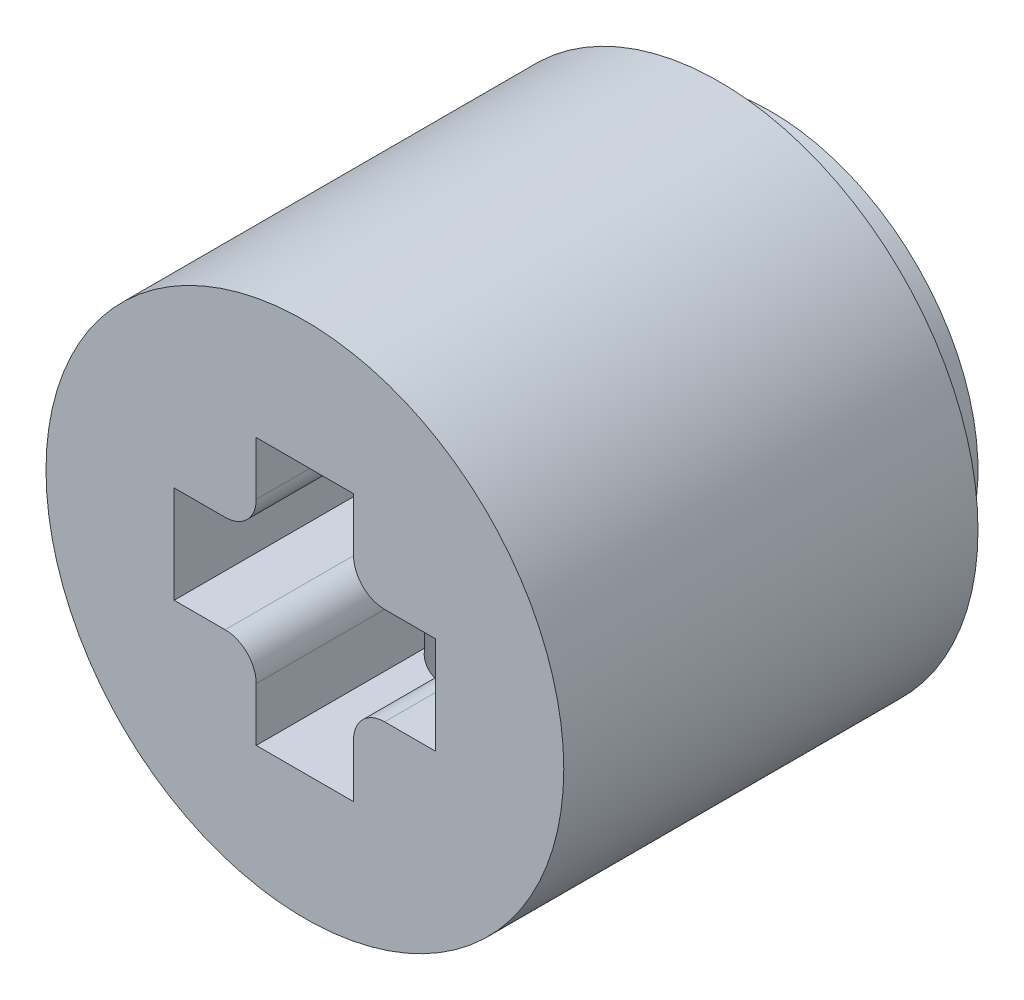
ISO-10303-21;
HEADER;
FILE_DESCRIPTION(('STEP AP214'),'2;1');
FILE_NAME('part.step','',(''),(''),'','','');
FILE_SCHEMA(('AUTOMOTIVE_DESIGN { 1 0 10303 214 1 1 1 1 }'));
ENDSEC;
DATA;
#1=APPLICATION_CONTEXT('core data for automotive mechanical design processes');
#2=APPLICATION_PROTOCOL_DEFINITION('international standard','automotive_design',2000,#1);
#3=PRODUCT_CONTEXT('',#1,'mechanical');
#4=PRODUCT('Part','Part','',(#3));
#5=PRODUCT_RELATED_PRODUCT_CATEGORY('part','',(#4));
#6=PRODUCT_DEFINITION_FORMATION('','',#4);
#7=PRODUCT_DEFINITION_CONTEXT('part definition',#1,'design');
#8=PRODUCT_DEFINITION('design','',#6,#7);
#9=PRODUCT_DEFINITION_SHAPE('','',#8);
#10=(LENGTH_UNIT() NAMED_UNIT(*) SI_UNIT(.MILLI.,.METRE.));
#11=(NAMED_UNIT(*) PLANE_ANGLE_UNIT() SI_UNIT($,.RADIAN.));
#12=(NAMED_UNIT(*) SI_UNIT($,.STERADIAN.) SOLID_ANGLE_UNIT());
#13=UNCERTAINTY_MEASURE_WITH_UNIT(LENGTH_MEASURE(1.E-05),#10,'distance_accuracy_value','');
#14=(GEOMETRIC_REPRESENTATION_CONTEXT(3) GLOBAL_UNCERTAINTY_ASSIGNED_CONTEXT((#13)) GLOBAL_UNIT_ASSIGNED_CONTEXT((#10,
#11,#12)) REPRESENTATION_CONTEXT('',''));
#15=CARTESIAN_POINT('',(0.,0.,0.));
#16=DIRECTION('',(0.,0.,1.));
#17=DIRECTION('',(1.,0.,0.));
#18=AXIS2_PLACEMENT_3D('',#15,#16,#17);
#19=CARTESIAN_POINT('',(0.,0.,8.));
#20=DIRECTION('',(0.,0.,-1.));
#21=DIRECTION('',(-1.,0.,0.));
#22=AXIS2_PLACEMENT_3D('',#19,#20,#21);
#23=CYLINDRICAL_SURFACE('',#22,5.);
#24=CARTESIAN_POINT('',(0.,0.,8.));
#25=DIRECTION('',(0.,0.,1.));
#26=DIRECTION('',(1.,0.,0.));
#27=AXIS2_PLACEMENT_3D('',#24,#25,#26);
#28=CIRCLE('',#27,5.);
#29=CARTESIAN_POINT('',(5.,0.,8.));
#30=VERTEX_POINT('',#29);
#31=EDGE_CURVE('E318',#30,#30,#28,.T.);
#32=ORIENTED_EDGE('',*,*,#31,.F.);
#33=EDGE_LOOP('',(#32));
#34=FACE_BOUND('',#33,.T.);
#35=CARTESIAN_POINT('',(0.,0.,0.));
#36=DIRECTION('',(0.,0.,1.));
#37=DIRECTION('',(1.,0.,0.));
#38=AXIS2_PLACEMENT_3D('',#35,#36,#37);
#39=CIRCLE('',#38,5.);
#40=CARTESIAN_POINT('',(5.,0.,0.));
#41=VERTEX_POINT('',#40);
#42=EDGE_CURVE('E322',#41,#41,#39,.T.);
#43=ORIENTED_EDGE('',*,*,#42,.T.);
#44=EDGE_LOOP('',(#43));
#45=FACE_BOUND('',#44,.T.);
#46=CARTESIAN_POINT('',(0.,-5.,2.8));
#47=CARTESIAN_POINT('',(0.0663855716114864,-4.99999882859871,2.80000200963091));
#48=CARTESIAN_POINT('',(0.132794168371227,-4.99866462539437,2.80552736409443));
#49=CARTESIAN_POINT('',(0.263713716388552,-4.99347135787729,2.82745309583815));
#50=CARTESIAN_POINT('',(0.328223473285709,-4.98961073848657,2.84386017119787));
#51=CARTESIAN_POINT('',(0.453435357885607,-4.97979292832786,2.88699693380174));
#52=CARTESIAN_POINT('',(0.51414176929929,-4.97383814811385,2.91371475594304));
#53=CARTESIAN_POINT('',(0.630210071519051,-4.96046901770033,2.97667417457835));
#54=CARTESIAN_POINT('',(0.685571885900661,-4.95305464663416,3.01291590723089));
#55=CARTESIAN_POINT('',(0.790437053575891,-4.93741544059215,3.09462567135023));
#56=CARTESIAN_POINT('',(0.839823808401929,-4.92917889817529,3.14024111241978));
#57=CARTESIAN_POINT('',(0.930324323247761,-4.91290297480301,3.23908754762578));
#58=CARTESIAN_POINT('',(0.971437218497919,-4.90486361453375,3.29231933681609));
#59=CARTESIAN_POINT('',(1.0447599742201,-4.88977518763566,3.40577833320728));
#60=CARTESIAN_POINT('',(1.0768415081904,-4.88274103265332,3.46609063350466));
#61=CARTESIAN_POINT('',(1.13036633178919,-4.87062933645708,3.59144793405027));
#62=CARTESIAN_POINT('',(1.15181117667772,-4.86555150921993,3.65649224080508));
#63=CARTESIAN_POINT('',(1.18306023243432,-4.85804738715009,3.78819062930807));
#64=CARTESIAN_POINT('',(1.19307304960329,-4.85557364192749,3.85479244861805));
#65=CARTESIAN_POINT('',(1.20182323551728,-4.85341558478987,3.98877295186686));
#66=CARTESIAN_POINT('',(1.20056228672949,-4.85373085664919,4.05615151838711));
#67=CARTESIAN_POINT('',(1.18696764832749,-4.85707245533718,4.1881903864046));
#68=CARTESIAN_POINT('',(1.1748804136019,-4.86003843681333,4.25287782607567));
#69=CARTESIAN_POINT('',(1.14036856654883,-4.86825134958978,4.37927892665928));
#70=CARTESIAN_POINT('',(1.11794326948813,-4.87349843197564,4.44099239029381));
#71=CARTESIAN_POINT('',(1.06317648492711,-4.88573906936737,4.5603651912337));
#72=CARTESIAN_POINT('',(1.03074379298784,-4.89274857302752,4.61798098116666));
#73=CARTESIAN_POINT('',(0.956946755825538,-4.90771500185066,4.72704180028904));
#74=CARTESIAN_POINT('',(0.915580961370592,-4.91567208064625,4.77848582611405));
#75=CARTESIAN_POINT('',(0.823805975635386,-4.93189281029482,4.87515742812749));
#76=CARTESIAN_POINT('',(0.773188257559633,-4.94015903152034,4.92018683962488));
#77=CARTESIAN_POINT('',(0.665022369838767,-4.95587806379738,5.00115388789855));
#78=CARTESIAN_POINT('',(0.607474019928563,-4.963330853682,5.03709128811705));
#79=CARTESIAN_POINT('',(0.486811390874324,-4.97661579827681,5.09891888824511));
#80=CARTESIAN_POINT('',(0.423681114784218,-4.98244308232075,5.12477898249512));
#81=CARTESIAN_POINT('',(0.293799042431471,-4.99178481896618,5.16546603161943));
#82=CARTESIAN_POINT('',(0.227047885355066,-4.99529967834603,5.18029492705073));
#83=CARTESIAN_POINT('',(0.0935149598606671,-4.99956110170834,5.19820082586081));
#84=CARTESIAN_POINT('',(0.0267713922180042,-5.00037128523014,5.20154795698463));
#85=CARTESIAN_POINT('',(-0.10632175263465,-4.99931229677893,5.19713329325964));
#86=CARTESIAN_POINT('',(-0.172671361905979,-4.99744334592699,5.18937241520511));
#87=CARTESIAN_POINT('',(-0.302169032043538,-4.99127665580872,5.16318520859344));
#88=CARTESIAN_POINT('',(-0.365348231724522,-4.98701206361468,5.14490435617047));
#89=CARTESIAN_POINT('',(-0.4877413200539,-4.9765334006264,5.0983607233219));
#90=CARTESIAN_POINT('',(-0.546954826656588,-4.97031914233272,5.07009698280879));
#91=CARTESIAN_POINT('',(-0.66082460398229,-4.9564764059839,5.00385336256082));
#92=CARTESIAN_POINT('',(-0.715388706961462,-4.94882612712371,4.96571971323012));
#93=CARTESIAN_POINT('',(-0.817439616386485,-4.93299745627709,4.88101722839477));
#94=CARTESIAN_POINT('',(-0.864925300297186,-4.92481898082043,4.83444705756819));
#95=CARTESIAN_POINT('',(-0.952569815159925,-4.90862968571996,4.73294366751606));
#96=CARTESIAN_POINT('',(-0.992539896190089,-4.90062677054122,4.67784595116521));
#97=CARTESIAN_POINT('',(-1.06266408329571,-4.88590155186362,4.56156382884325));
#98=CARTESIAN_POINT('',(-1.09281862889111,-4.8791791910297,4.50037969556988));
#99=CARTESIAN_POINT('',(-1.14223597407393,-4.86784758090162,4.37399499457781));
#100=CARTESIAN_POINT('',(-1.16156301755047,-4.86322589900105,4.30882071861005));
#101=CARTESIAN_POINT('',(-1.18895352114302,-4.85660290702284,4.17602152596881));
#102=CARTESIAN_POINT('',(-1.19701921710175,-4.85460107680137,4.10839709848778));
#103=CARTESIAN_POINT('',(-1.20154826579577,-4.85348184870242,3.97453171989209));
#104=CARTESIAN_POINT('',(-1.19831242636862,-4.85428966532108,3.90830140147048));
#105=CARTESIAN_POINT('',(-1.18101338250551,-4.85852705844985,3.77736009430937));
#106=CARTESIAN_POINT('',(-1.1669503636005,-4.8619565900351,3.71264907955515));
#107=CARTESIAN_POINT('',(-1.12855436521403,-4.87101099906117,3.58688097898101));
#108=CARTESIAN_POINT('',(-1.10427360818242,-4.87662470243525,3.52580709096658));
#109=CARTESIAN_POINT('',(-1.04617349432236,-4.88941734450978,3.40855823444644));
#110=CARTESIAN_POINT('',(-1.01235291973943,-4.89659648301093,3.35238389256544));
#111=CARTESIAN_POINT('',(-0.935172030833846,-4.91192773021097,3.24506519995222));
#112=CARTESIAN_POINT('',(-0.891601071916071,-4.92009914790113,3.19407507076052));
#113=CARTESIAN_POINT('',(-0.796572299092949,-4.93637439324597,3.10003200477923));
#114=CARTESIAN_POINT('',(-0.745112635496937,-4.94447820457766,3.0569809347159));
#115=CARTESIAN_POINT('',(-0.634753199520559,-4.9598628119832,2.9793562961781));
#116=CARTESIAN_POINT('',(-0.575745657437607,-4.96712800804875,2.9449326378232));
#117=CARTESIAN_POINT('',(-0.452614491314269,-4.97985522442328,2.88654818690084));
#118=CARTESIAN_POINT('',(-0.388494789476489,-4.98531861091419,2.86257946264335));
#119=CARTESIAN_POINT('',(-0.270354810277907,-4.99296239605987,2.82958454994488));
#120=CARTESIAN_POINT('',(-0.216924826507369,-4.99558397798318,2.81851335368572));
#121=CARTESIAN_POINT('',(-0.1090016909913,-4.99910320598099,2.80372048765925));
#122=CARTESIAN_POINT('',(-0.0545086071663108,-5.00000096182726,2.79999834990979));
#123=CARTESIAN_POINT('',(0.,-5.,2.8));
#124=B_SPLINE_CURVE_WITH_KNOTS('',3,(#46,#47,#48,#49,#50,#51,#52,#53,#54,#55,#56,#57,#58,#59,
#60,#61,#62,#63,#64,#65,#66,#67,#68,#69,#70,#71,#72,#73,#74,#75,#76,#77,#78,#79,#80,#81,#82,#83,
#84,#85,#86,#87,#88,#89,#90,#91,#92,#93,#94,#95,#96,#97,#98,#99,#100,#101,#102,#103,#104,#105,
#106,#107,#108,#109,#110,#111,#112,#113,#114,#115,#116,#117,#118,#119,#120,#121,#122,#123),
.UNSPECIFIED.,.T.,.F.,(4,2,2,2,2,2,2,2,2,2,2,2,2,2,2,2,2,2,2,2,2,2,2,2,2,2,2,2,2,2,2,2,2,2,2,2,
2,2,4),(0.,0.198957039746671,0.398036658303529,0.596887865634004,0.795741915994077,
0.998002280593426,1.20028377413322,1.40530904820339,1.61030433534015,1.81149598142534,
2.01265760269938,2.20935309983687,2.40606162681407,2.60461867006221,2.80320794977753,
3.00699983350526,3.2107970189862,3.41519845869033,3.61956393253918,3.81908710722082,
4.01859381530139,4.21540574945676,4.41223661682595,4.61234093252929,4.81247694820674,
5.0171129809052,5.22173984915262,5.42513936473276,5.62849849136058,5.82648661814791,
6.02447135235182,6.2214562540112,6.418466312115,6.62023378437708,6.82204863829062,
7.02715896821391,7.23211341832259,7.39548569211949,7.55884756216546),.UNSPECIFIED.);
#125=CARTESIAN_POINT('',(0.,-5.,2.8));
#126=VERTEX_POINT('',#125);
#127=EDGE_CURVE('E236',#126,#126,#124,.T.);
#128=ORIENTED_EDGE('',*,*,#127,.F.);
#129=EDGE_LOOP('',(#128));
#130=FACE_BOUND('',#129,.T.);
#131=ADVANCED_FACE('F69',(#34,#45,#130),#23,.T.);
#132=CARTESIAN_POINT('',(0.939999999999999,2.575,-1.));
#133=DIRECTION('',(-1.,0.,0.));
#134=DIRECTION('',(0.,-1.,0.));
#135=AXIS2_PLACEMENT_3D('',#132,#133,#134);
#136=PLANE('',#135);
#137=DIRECTION('',(0.,0.,1.));
#138=VECTOR('',#137,1.);
#139=CARTESIAN_POINT('',(0.94,-2.575,-1.));
#140=LINE('',#139,#138);
#141=CARTESIAN_POINT('',(0.94,-2.575,-1.));
#142=VERTEX_POINT('',#141);
#143=CARTESIAN_POINT('',(0.94,-2.575,3.25407775204114));
#144=VERTEX_POINT('',#143);
#145=EDGE_CURVE('E414',#142,#144,#140,.T.);
#146=ORIENTED_EDGE('',*,*,#145,.T.);
#147=DIRECTION('',(0.,-1.,0.));
#148=VECTOR('',#147,1.);
#149=CARTESIAN_POINT('',(0.94,-2.075,3.25407775204114));
#150=LINE('',#149,#148);
#151=CARTESIAN_POINT('',(0.94,-2.075,3.25407775204114));
#152=VERTEX_POINT('',#151);
#153=EDGE_CURVE('E228',#144,#152,#150,.F.);
#154=ORIENTED_EDGE('',*,*,#153,.T.);
#155=DIRECTION('',(0.,0.,-1.));
#156=VECTOR('',#155,1.);
#157=CARTESIAN_POINT('',(0.94,-2.075,-1.));
#158=LINE('',#157,#156);
#159=CARTESIAN_POINT('',(0.94,-2.075,4.74592224795886));
#160=VERTEX_POINT('',#159);
#161=EDGE_CURVE('E223',#160,#152,#158,.T.);
#162=ORIENTED_EDGE('',*,*,#161,.F.);
#163=DIRECTION('',(0.,-1.,0.));
#164=VECTOR('',#163,1.);
#165=CARTESIAN_POINT('',(0.94,-2.075,4.74592224795886));
#166=LINE('',#165,#164);
#167=CARTESIAN_POINT('',(0.94,-2.575,4.74592224795886));
#168=VERTEX_POINT('',#167);
#169=EDGE_CURVE('E207',#160,#168,#166,.T.);
#170=ORIENTED_EDGE('',*,*,#169,.T.);
#171=CARTESIAN_POINT('',(0.94,-2.575,8.));
#172=VERTEX_POINT('',#171);
#173=EDGE_CURVE('E397',#168,#172,#140,.T.);
#174=ORIENTED_EDGE('',*,*,#173,.T.);
#175=DIRECTION('',(0.,-1.,0.));
#176=VECTOR('',#175,1.);
#177=CARTESIAN_POINT('',(0.939999999999999,2.575,8.));
#178=LINE('',#177,#176);
#179=CARTESIAN_POINT('',(0.94,-1.54,8.));
#180=VERTEX_POINT('',#179);
#181=EDGE_CURVE('E481',#180,#172,#178,.T.);
#182=ORIENTED_EDGE('',*,*,#181,.F.);
#183=DIRECTION('',(0.,0.,-1.));
#184=VECTOR('',#183,1.);
#185=CARTESIAN_POINT('',(0.94,-1.54,-1.));
#186=LINE('',#185,#184);
#187=CARTESIAN_POINT('',(0.94,-1.54,-1.));
#188=VERTEX_POINT('',#187);
#189=EDGE_CURVE('E374',#180,#188,#186,.T.);
#190=ORIENTED_EDGE('',*,*,#189,.T.);
#191=DIRECTION('',(0.,-1.,0.));
#192=VECTOR('',#191,1.);
#193=CARTESIAN_POINT('',(0.939999999999999,2.575,-1.));
#194=LINE('',#193,#192);
#195=EDGE_CURVE('E466',#188,#142,#194,.T.);
#196=ORIENTED_EDGE('',*,*,#195,.T.);
#197=EDGE_LOOP('',(#146,#154,#162,#170,#174,#182,#190,#196));
#198=FACE_BOUND('',#197,.T.);
#199=ADVANCED_FACE('F227',(#198),#136,.T.);
#200=CARTESIAN_POINT('',(-0.94,-2.575,-1.));
#201=DIRECTION('',(0.,-1.,0.));
#202=DIRECTION('',(0.,0.,-1.));
#203=AXIS2_PLACEMENT_3D('',#200,#201,#202);
#204=PLANE('',#203);
#205=CARTESIAN_POINT('',(0.,-2.575,4.));
#206=DIRECTION('',(0.,-1.,0.));
#207=DIRECTION('',(0.,0.,-1.));
#208=AXIS2_PLACEMENT_3D('',#205,#206,#207);
#209=CIRCLE('',#208,1.2);
#210=CARTESIAN_POINT('',(-0.94,-2.575,4.74592224795886));
#211=VERTEX_POINT('',#210);
#212=EDGE_CURVE('E214',#211,#168,#209,.F.);
#213=ORIENTED_EDGE('',*,*,#212,.F.);
#214=DIRECTION('',(0.,0.,1.));
#215=VECTOR('',#214,1.);
#216=CARTESIAN_POINT('',(-0.94,-2.575,-1.));
#217=LINE('',#216,#215);
#218=CARTESIAN_POINT('',(-0.94,-2.575,8.));
#219=VERTEX_POINT('',#218);
#220=EDGE_CURVE('E395',#211,#219,#217,.T.);
#221=ORIENTED_EDGE('',*,*,#220,.T.);
#222=DIRECTION('',(1.,0.,0.));
#223=VECTOR('',#222,1.);
#224=CARTESIAN_POINT('',(-0.94,-2.575,8.));
#225=LINE('',#224,#223);
#226=EDGE_CURVE('E485',#219,#172,#225,.T.);
#227=ORIENTED_EDGE('',*,*,#226,.T.);
#228=ORIENTED_EDGE('',*,*,#173,.F.);
#229=EDGE_LOOP('',(#213,#221,#227,#228));
#230=FACE_BOUND('',#229,.T.);
#231=ADVANCED_FACE('F279',(#230),#204,.F.);
#232=CARTESIAN_POINT('',(-0.940000000000001,2.575,-1.));
#233=DIRECTION('',(-1.,0.,0.));
#234=DIRECTION('',(0.,-1.,0.));
#235=AXIS2_PLACEMENT_3D('',#232,#233,#234);
#236=PLANE('',#235);
#237=DIRECTION('',(0.,-1.,0.));
#238=VECTOR('',#237,1.);
#239=CARTESIAN_POINT('',(-0.94,-2.075,3.25407775204114));
#240=LINE('',#239,#238);
#241=CARTESIAN_POINT('',(-0.94,-2.575,3.25407775204114));
#242=VERTEX_POINT('',#241);
#243=CARTESIAN_POINT('',(-0.94,-2.075,3.25407775204114));
#244=VERTEX_POINT('',#243);
#245=EDGE_CURVE('E12',#242,#244,#240,.F.);
#246=ORIENTED_EDGE('',*,*,#245,.F.);
#247=CARTESIAN_POINT('',(-0.94,-2.575,-1.));
#248=VERTEX_POINT('',#247);
#249=EDGE_CURVE('E403',#248,#242,#217,.T.);
#250=ORIENTED_EDGE('',*,*,#249,.F.);
#251=DIRECTION('',(0.,-1.,0.));
#252=VECTOR('',#251,1.);
#253=CARTESIAN_POINT('',(-0.940000000000001,2.575,-1.));
#254=LINE('',#253,#252);
#255=CARTESIAN_POINT('',(-0.94,-1.54,-1.));
#256=VERTEX_POINT('',#255);
#257=EDGE_CURVE('E475',#256,#248,#254,.T.);
#258=ORIENTED_EDGE('',*,*,#257,.F.);
#259=DIRECTION('',(0.,0.,-1.));
#260=VECTOR('',#259,1.);
#261=CARTESIAN_POINT('',(-0.94,-1.54,-1.));
#262=LINE('',#261,#260);
#263=CARTESIAN_POINT('',(-0.94,-1.54,8.));
#264=VERTEX_POINT('',#263);
#265=EDGE_CURVE('E371',#256,#264,#262,.F.);
#266=ORIENTED_EDGE('',*,*,#265,.T.);
#267=DIRECTION('',(0.,-1.,0.));
#268=VECTOR('',#267,1.);
#269=CARTESIAN_POINT('',(-0.940000000000001,2.575,8.));
#270=LINE('',#269,#268);
#271=EDGE_CURVE('E400',#264,#219,#270,.T.);
#272=ORIENTED_EDGE('',*,*,#271,.T.);
#273=ORIENTED_EDGE('',*,*,#220,.F.);
#274=DIRECTION('',(0.,-1.,0.));
#275=VECTOR('',#274,1.);
#276=CARTESIAN_POINT('',(-0.94,-2.075,4.74592224795886));
#277=LINE('',#276,#275);
#278=CARTESIAN_POINT('',(-0.94,-2.075,4.74592224795886));
#279=VERTEX_POINT('',#278);
#280=EDGE_CURVE('E78',#279,#211,#277,.T.);
#281=ORIENTED_EDGE('',*,*,#280,.F.);
#282=DIRECTION('',(0.,0.,-1.));
#283=VECTOR('',#282,1.);
#284=CARTESIAN_POINT('',(-0.94,-2.075,-1.));
#285=LINE('',#284,#283);
#286=EDGE_CURVE('E387',#279,#244,#285,.T.);
#287=ORIENTED_EDGE('',*,*,#286,.T.);
#288=EDGE_LOOP('',(#246,#250,#258,#266,#272,#273,#281,#287));
#289=FACE_BOUND('',#288,.T.);
#290=ADVANCED_FACE('F275',(#289),#236,.F.);
#291=CARTESIAN_POINT('',(0.,0.,8.));
#292=DIRECTION('',(0.,0.,1.));
#293=DIRECTION('',(1.,0.,0.));
#294=AXIS2_PLACEMENT_3D('',#291,#292,#293);
#295=PLANE('',#294);
#296=ORIENTED_EDGE('',*,*,#31,.T.);
#297=EDGE_LOOP('',(#296));
#298=FACE_BOUND('',#297,.T.);
#299=DIRECTION('',(1.,0.,0.));
#300=VECTOR('',#299,1.);
#301=CARTESIAN_POINT('',(-2.525,0.94,8.));
#302=LINE('',#301,#300);
#303=CARTESIAN_POINT('',(-2.525,0.94,8.));
#304=VERTEX_POINT('',#303);
#305=CARTESIAN_POINT('',(-1.54,0.94,8.));
#306=VERTEX_POINT('',#305);
#307=EDGE_CURVE('E446',#304,#306,#302,.T.);
#308=ORIENTED_EDGE('',*,*,#307,.T.);
#309=CARTESIAN_POINT('',(-1.54,1.54,8.));
#310=DIRECTION('',(0.,0.,1.));
#311=DIRECTION('',(1.,0.,0.));
#312=AXIS2_PLACEMENT_3D('',#309,#310,#311);
#313=CIRCLE('',#312,0.6);
#314=CARTESIAN_POINT('',(-0.94,1.54,8.));
#315=VERTEX_POINT('',#314);
#316=EDGE_CURVE('E364',#306,#315,#313,.T.);
#317=ORIENTED_EDGE('',*,*,#316,.T.);
#318=CARTESIAN_POINT('',(-0.940000000000001,2.575,8.));
#319=VERTEX_POINT('',#318);
#320=EDGE_CURVE('E467',#319,#315,#270,.T.);
#321=ORIENTED_EDGE('',*,*,#320,.F.);
#322=DIRECTION('',(1.,0.,0.));
#323=VECTOR('',#322,1.);
#324=CARTESIAN_POINT('',(-0.940000000000001,2.575,8.));
#325=LINE('',#324,#323);
#326=CARTESIAN_POINT('',(0.939999999999999,2.575,8.));
#327=VERTEX_POINT('',#326);
#328=EDGE_CURVE('E245',#319,#327,#325,.T.);
#329=ORIENTED_EDGE('',*,*,#328,.T.);
#330=CARTESIAN_POINT('',(0.94,1.54,8.));
#331=VERTEX_POINT('',#330);
#332=EDGE_CURVE('E482',#327,#331,#178,.T.);
#333=ORIENTED_EDGE('',*,*,#332,.T.);
#334=CARTESIAN_POINT('',(1.54,1.54,8.));
#335=DIRECTION('',(0.,0.,1.));
#336=DIRECTION('',(1.,0.,0.));
#337=AXIS2_PLACEMENT_3D('',#334,#335,#336);
#338=CIRCLE('',#337,0.6);
#339=CARTESIAN_POINT('',(1.54,0.94,8.));
#340=VERTEX_POINT('',#339);
#341=EDGE_CURVE('E355',#331,#340,#338,.T.);
#342=ORIENTED_EDGE('',*,*,#341,.T.);
#343=CARTESIAN_POINT('',(2.525,0.94,8.));
#344=VERTEX_POINT('',#343);
#345=EDGE_CURVE('E445',#340,#344,#302,.T.);
#346=ORIENTED_EDGE('',*,*,#345,.T.);
#347=DIRECTION('',(0.,-1.,0.));
#348=VECTOR('',#347,1.);
#349=CARTESIAN_POINT('',(2.525,0.94,8.));
#350=LINE('',#349,#348);
#351=CARTESIAN_POINT('',(2.525,-0.94,8.));
#352=VERTEX_POINT('',#351);
#353=EDGE_CURVE('E441',#344,#352,#350,.T.);
#354=ORIENTED_EDGE('',*,*,#353,.T.);
#355=DIRECTION('',(1.,0.,0.));
#356=VECTOR('',#355,1.);
#357=CARTESIAN_POINT('',(-2.525,-0.94,8.));
#358=LINE('',#357,#356);
#359=CARTESIAN_POINT('',(1.54,-0.94,8.));
#360=VERTEX_POINT('',#359);
#361=EDGE_CURVE('E428',#360,#352,#358,.T.);
#362=ORIENTED_EDGE('',*,*,#361,.F.);
#363=CARTESIAN_POINT('',(1.54,-1.54,8.));
#364=DIRECTION('',(0.,0.,1.));
#365=DIRECTION('',(1.,0.,0.));
#366=AXIS2_PLACEMENT_3D('',#363,#364,#365);
#367=CIRCLE('',#366,0.6);
#368=EDGE_CURVE('E358',#360,#180,#367,.T.);
#369=ORIENTED_EDGE('',*,*,#368,.T.);
#370=ORIENTED_EDGE('',*,*,#181,.T.);
#371=ORIENTED_EDGE('',*,*,#226,.F.);
#372=ORIENTED_EDGE('',*,*,#271,.F.);
#373=CARTESIAN_POINT('',(-1.54,-1.54,8.));
#374=DIRECTION('',(0.,0.,1.));
#375=DIRECTION('',(1.,0.,0.));
#376=AXIS2_PLACEMENT_3D('',#373,#374,#375);
#377=CIRCLE('',#376,0.6);
#378=CARTESIAN_POINT('',(-1.54,-0.94,8.));
#379=VERTEX_POINT('',#378);
#380=EDGE_CURVE('E361',#264,#379,#377,.T.);
#381=ORIENTED_EDGE('',*,*,#380,.T.);
#382=CARTESIAN_POINT('',(-2.525,-0.94,8.));
#383=VERTEX_POINT('',#382);
#384=EDGE_CURVE('E433',#383,#379,#358,.T.);
#385=ORIENTED_EDGE('',*,*,#384,.F.);
#386=DIRECTION('',(0.,-1.,0.));
#387=VECTOR('',#386,1.);
#388=CARTESIAN_POINT('',(-2.525,0.94,8.));
#389=LINE('',#388,#387);
#390=EDGE_CURVE('E420',#304,#383,#389,.T.);
#391=ORIENTED_EDGE('',*,*,#390,.F.);
#392=EDGE_LOOP('',(#308,#317,#321,#329,#333,#342,#346,#354,#362,#369,#370,#371,#372,#381,#385,#391));
#393=FACE_BOUND('',#392,.T.);
#394=ADVANCED_FACE('F278',(#298,#393),#295,.T.);
#395=CARTESIAN_POINT('',(0.,0.,-1.));
#396=DIRECTION('',(0.,0.,-1.));
#397=DIRECTION('',(-1.,0.,0.));
#398=AXIS2_PLACEMENT_3D('',#395,#396,#397);
#399=PLANE('',#398);
#400=CARTESIAN_POINT('',(0.,0.,-1.));
#401=DIRECTION('',(0.,0.,-1.));
#402=DIRECTION('',(-1.,0.,0.));
#403=AXIS2_PLACEMENT_3D('',#400,#401,#402);
#404=CIRCLE('',#403,4.);
#405=CARTESIAN_POINT('',(-4.,0.,-1.));
#406=VERTEX_POINT('',#405);
#407=EDGE_CURVE('E325',#406,#406,#404,.T.);
#408=ORIENTED_EDGE('',*,*,#407,.T.);
#409=EDGE_LOOP('',(#408));
#410=FACE_BOUND('',#409,.T.);
#411=CARTESIAN_POINT('',(-0.940000000000001,2.575,-1.));
#412=VERTEX_POINT('',#411);
#413=CARTESIAN_POINT('',(-0.94,1.54,-1.));
#414=VERTEX_POINT('',#413);
#415=EDGE_CURVE('E410',#412,#414,#254,.T.);
#416=ORIENTED_EDGE('',*,*,#415,.T.);
#417=CARTESIAN_POINT('',(-1.54,1.54,-1.));
#418=DIRECTION('',(0.,0.,-1.));
#419=DIRECTION('',(-1.,0.,0.));
#420=AXIS2_PLACEMENT_3D('',#417,#418,#419);
#421=CIRCLE('',#420,0.6);
#422=CARTESIAN_POINT('',(-1.54,0.94,-1.));
#423=VERTEX_POINT('',#422);
#424=EDGE_CURVE('E349',#414,#423,#421,.T.);
#425=ORIENTED_EDGE('',*,*,#424,.T.);
#426=DIRECTION('',(1.,0.,0.));
#427=VECTOR('',#426,1.);
#428=CARTESIAN_POINT('',(-2.525,0.94,-1.));
#429=LINE('',#428,#427);
#430=CARTESIAN_POINT('',(-2.525,0.94,-1.));
#431=VERTEX_POINT('',#430);
#432=EDGE_CURVE('E436',#431,#423,#429,.T.);
#433=ORIENTED_EDGE('',*,*,#432,.F.);
#434=DIRECTION('',(0.,-1.,0.));
#435=VECTOR('',#434,1.);
#436=CARTESIAN_POINT('',(-2.525,0.94,-1.));
#437=LINE('',#436,#435);
#438=CARTESIAN_POINT('',(-2.525,-0.94,-1.));
#439=VERTEX_POINT('',#438);
#440=EDGE_CURVE('E246',#431,#439,#437,.T.);
#441=ORIENTED_EDGE('',*,*,#440,.T.);
#442=DIRECTION('',(1.,0.,0.));
#443=VECTOR('',#442,1.);
#444=CARTESIAN_POINT('',(-2.525,-0.94,-1.));
#445=LINE('',#444,#443);
#446=CARTESIAN_POINT('',(-1.54,-0.94,-1.));
#447=VERTEX_POINT('',#446);
#448=EDGE_CURVE('E521',#439,#447,#445,.T.);
#449=ORIENTED_EDGE('',*,*,#448,.T.);
#450=CARTESIAN_POINT('',(-1.54,-1.54,-1.));
#451=DIRECTION('',(0.,0.,-1.));
#452=DIRECTION('',(-1.,0.,0.));
#453=AXIS2_PLACEMENT_3D('',#450,#451,#452);
#454=CIRCLE('',#453,0.6);
#455=EDGE_CURVE('E346',#447,#256,#454,.T.);
#456=ORIENTED_EDGE('',*,*,#455,.T.);
#457=ORIENTED_EDGE('',*,*,#257,.T.);
#458=DIRECTION('',(1.,0.,0.));
#459=VECTOR('',#458,1.);
#460=CARTESIAN_POINT('',(-0.94,-2.575,-1.));
#461=LINE('',#460,#459);
#462=EDGE_CURVE('E471',#248,#142,#461,.T.);
#463=ORIENTED_EDGE('',*,*,#462,.T.);
#464=ORIENTED_EDGE('',*,*,#195,.F.);
#465=CARTESIAN_POINT('',(1.54,-1.54,-1.));
#466=DIRECTION('',(0.,0.,-1.));
#467=DIRECTION('',(-1.,0.,0.));
#468=AXIS2_PLACEMENT_3D('',#465,#466,#467);
#469=CIRCLE('',#468,0.6);
#470=CARTESIAN_POINT('',(1.54,-0.94,-1.));
#471=VERTEX_POINT('',#470);
#472=EDGE_CURVE('E343',#188,#471,#469,.T.);
#473=ORIENTED_EDGE('',*,*,#472,.T.);
#474=CARTESIAN_POINT('',(2.525,-0.94,-1.));
#475=VERTEX_POINT('',#474);
#476=EDGE_CURVE('E515',#471,#475,#445,.T.);
#477=ORIENTED_EDGE('',*,*,#476,.T.);
#478=DIRECTION('',(0.,-1.,0.));
#479=VECTOR('',#478,1.);
#480=CARTESIAN_POINT('',(2.525,0.94,-1.));
#481=LINE('',#480,#479);
#482=CARTESIAN_POINT('',(2.525,0.94,-1.));
#483=VERTEX_POINT('',#482);
#484=EDGE_CURVE('E524',#483,#475,#481,.T.);
#485=ORIENTED_EDGE('',*,*,#484,.F.);
#486=CARTESIAN_POINT('',(1.54,0.94,-1.));
#487=VERTEX_POINT('',#486);
#488=EDGE_CURVE('E527',#487,#483,#429,.T.);
#489=ORIENTED_EDGE('',*,*,#488,.F.);
#490=CARTESIAN_POINT('',(1.54,1.54,-1.));
#491=DIRECTION('',(0.,0.,-1.));
#492=DIRECTION('',(-1.,0.,0.));
#493=AXIS2_PLACEMENT_3D('',#490,#491,#492);
#494=CIRCLE('',#493,0.6);
#495=CARTESIAN_POINT('',(0.94,1.54,-1.));
#496=VERTEX_POINT('',#495);
#497=EDGE_CURVE('E340',#487,#496,#494,.T.);
#498=ORIENTED_EDGE('',*,*,#497,.T.);
#499=CARTESIAN_POINT('',(0.939999999999999,2.575,-1.));
#500=VERTEX_POINT('',#499);
#501=EDGE_CURVE('E468',#500,#496,#194,.T.);
#502=ORIENTED_EDGE('',*,*,#501,.F.);
#503=DIRECTION('',(1.,0.,0.));
#504=VECTOR('',#503,1.);
#505=CARTESIAN_POINT('',(-0.940000000000001,2.575,-1.));
#506=LINE('',#505,#504);
#507=EDGE_CURVE('E463',#412,#500,#506,.T.);
#508=ORIENTED_EDGE('',*,*,#507,.F.);
#509=EDGE_LOOP('',(#416,#425,#433,#441,#449,#456,#457,#463,#464,#473,#477,#485,#489,#498,#502,#508));
#510=FACE_BOUND('',#509,.T.);
#511=ADVANCED_FACE('F294',(#410,#510),#399,.T.);
#512=CARTESIAN_POINT('',(0.,0.,0.));
#513=DIRECTION('',(0.,0.,1.));
#514=DIRECTION('',(1.,0.,0.));
#515=AXIS2_PLACEMENT_3D('',#512,#513,#514);
#516=PLANE('',#515);
#517=CARTESIAN_POINT('',(0.,0.,0.));
#518=DIRECTION('',(0.,0.,-1.));
#519=DIRECTION('',(-1.,0.,0.));
#520=AXIS2_PLACEMENT_3D('',#517,#518,#519);
#521=CIRCLE('',#520,4.);
#522=CARTESIAN_POINT('',(-4.,0.,0.));
#523=VERTEX_POINT('',#522);
#524=EDGE_CURVE('E329',#523,#523,#521,.T.);
#525=ORIENTED_EDGE('',*,*,#524,.F.);
#526=EDGE_LOOP('',(#525));
#527=FACE_BOUND('',#526,.T.);
#528=ORIENTED_EDGE('',*,*,#42,.F.);
#529=EDGE_LOOP('',(#528));
#530=FACE_BOUND('',#529,.T.);
#531=ADVANCED_FACE('F297',(#527,#530),#516,.F.);
#532=CARTESIAN_POINT('',(0.,0.,-1.));
#533=DIRECTION('',(0.,0.,1.));
#534=DIRECTION('',(1.,0.,0.));
#535=AXIS2_PLACEMENT_3D('',#532,#533,#534);
#536=CYLINDRICAL_SURFACE('',#535,4.);
#537=ORIENTED_EDGE('',*,*,#407,.F.);
#538=EDGE_LOOP('',(#537));
#539=FACE_BOUND('',#538,.T.);
#540=ORIENTED_EDGE('',*,*,#524,.T.);
#541=EDGE_LOOP('',(#540));
#542=FACE_BOUND('',#541,.T.);
#543=ADVANCED_FACE('F270',(#539,#542),#536,.T.);
#544=CARTESIAN_POINT('',(-2.525,-0.94,-1.));
#545=DIRECTION('',(0.,-1.,0.));
#546=DIRECTION('',(0.,0.,-1.));
#547=AXIS2_PLACEMENT_3D('',#544,#545,#546);
#548=PLANE('',#547);
#549=ORIENTED_EDGE('',*,*,#384,.T.);
#550=DIRECTION('',(0.,0.,-1.));
#551=VECTOR('',#550,1.);
#552=CARTESIAN_POINT('',(-1.54,-0.94,-1.));
#553=LINE('',#552,#551);
#554=EDGE_CURVE('E367',#379,#447,#553,.T.);
#555=ORIENTED_EDGE('',*,*,#554,.T.);
#556=ORIENTED_EDGE('',*,*,#448,.F.);
#557=DIRECTION('',(0.,0.,1.));
#558=VECTOR('',#557,1.);
#559=CARTESIAN_POINT('',(-2.525,-0.94,-1.));
#560=LINE('',#559,#558);
#561=EDGE_CURVE('E460',#439,#383,#560,.T.);
#562=ORIENTED_EDGE('',*,*,#561,.T.);
#563=EDGE_LOOP('',(#549,#555,#556,#562));
#564=FACE_BOUND('',#563,.T.);
#565=ADVANCED_FACE('F267',(#564),#548,.F.);
#566=CARTESIAN_POINT('',(-2.525,0.94,-1.));
#567=DIRECTION('',(-1.,0.,0.));
#568=DIRECTION('',(0.,0.,1.));
#569=AXIS2_PLACEMENT_3D('',#566,#567,#568);
#570=PLANE('',#569);
#571=ORIENTED_EDGE('',*,*,#390,.T.);
#572=ORIENTED_EDGE('',*,*,#561,.F.);
#573=ORIENTED_EDGE('',*,*,#440,.F.);
#574=DIRECTION('',(0.,0.,1.));
#575=VECTOR('',#574,1.);
#576=CARTESIAN_POINT('',(-2.525,0.94,-1.));
#577=LINE('',#576,#575);
#578=EDGE_CURVE('E332',#431,#304,#577,.T.);
#579=ORIENTED_EDGE('',*,*,#578,.T.);
#580=EDGE_LOOP('',(#571,#572,#573,#579));
#581=FACE_BOUND('',#580,.T.);
#582=ADVANCED_FACE('F260',(#581),#570,.F.);
#583=CARTESIAN_POINT('',(-2.525,0.94,-1.));
#584=DIRECTION('',(0.,-1.,0.));
#585=DIRECTION('',(0.,0.,-1.));
#586=AXIS2_PLACEMENT_3D('',#583,#584,#585);
#587=PLANE('',#586);
#588=ORIENTED_EDGE('',*,*,#432,.T.);
#589=DIRECTION('',(0.,0.,-1.));
#590=VECTOR('',#589,1.);
#591=CARTESIAN_POINT('',(-1.54,0.94,8.));
#592=LINE('',#591,#590);
#593=EDGE_CURVE('E352',#423,#306,#592,.F.);
#594=ORIENTED_EDGE('',*,*,#593,.T.);
#595=ORIENTED_EDGE('',*,*,#307,.F.);
#596=ORIENTED_EDGE('',*,*,#578,.F.);
#597=EDGE_LOOP('',(#588,#594,#595,#596));
#598=FACE_BOUND('',#597,.T.);
#599=ADVANCED_FACE('F256',(#598),#587,.T.);
#600=CARTESIAN_POINT('',(2.525,0.94,-1.));
#601=DIRECTION('',(-1.,0.,0.));
#602=DIRECTION('',(0.,-1.,0.));
#603=AXIS2_PLACEMENT_3D('',#600,#601,#602);
#604=PLANE('',#603);
#605=ORIENTED_EDGE('',*,*,#353,.F.);
#606=DIRECTION('',(0.,0.,1.));
#607=VECTOR('',#606,1.);
#608=CARTESIAN_POINT('',(2.525,0.94,-1.));
#609=LINE('',#608,#607);
#610=EDGE_CURVE('E452',#483,#344,#609,.T.);
#611=ORIENTED_EDGE('',*,*,#610,.F.);
#612=ORIENTED_EDGE('',*,*,#484,.T.);
#613=DIRECTION('',(0.,0.,1.));
#614=VECTOR('',#613,1.);
#615=CARTESIAN_POINT('',(2.525,-0.94,-1.));
#616=LINE('',#615,#614);
#617=EDGE_CURVE('E456',#475,#352,#616,.T.);
#618=ORIENTED_EDGE('',*,*,#617,.T.);
#619=EDGE_LOOP('',(#605,#611,#612,#618));
#620=FACE_BOUND('',#619,.T.);
#621=ADVANCED_FACE('F259',(#620),#604,.T.);
#622=ORIENTED_EDGE('',*,*,#476,.F.);
#623=DIRECTION('',(0.,0.,-1.));
#624=VECTOR('',#623,1.);
#625=CARTESIAN_POINT('',(1.54,-0.94,8.));
#626=LINE('',#625,#624);
#627=EDGE_CURVE('E378',#471,#360,#626,.F.);
#628=ORIENTED_EDGE('',*,*,#627,.T.);
#629=ORIENTED_EDGE('',*,*,#361,.T.);
#630=ORIENTED_EDGE('',*,*,#617,.F.);
#631=EDGE_LOOP('',(#622,#628,#629,#630));
#632=FACE_BOUND('',#631,.T.);
#633=ADVANCED_FACE('F265',(#632),#548,.F.);
#634=ORIENTED_EDGE('',*,*,#345,.F.);
#635=DIRECTION('',(0.,0.,-1.));
#636=VECTOR('',#635,1.);
#637=CARTESIAN_POINT('',(1.54,0.94,-1.));
#638=LINE('',#637,#636);
#639=EDGE_CURVE('E381',#340,#487,#638,.T.);
#640=ORIENTED_EDGE('',*,*,#639,.T.);
#641=ORIENTED_EDGE('',*,*,#488,.T.);
#642=ORIENTED_EDGE('',*,*,#610,.T.);
#643=EDGE_LOOP('',(#634,#640,#641,#642));
#644=FACE_BOUND('',#643,.T.);
#645=ADVANCED_FACE('F262',(#644),#587,.T.);
#646=EDGE_CURVE('E219',#144,#242,#209,.F.);
#647=ORIENTED_EDGE('',*,*,#646,.F.);
#648=ORIENTED_EDGE('',*,*,#145,.F.);
#649=ORIENTED_EDGE('',*,*,#462,.F.);
#650=ORIENTED_EDGE('',*,*,#249,.T.);
#651=EDGE_LOOP('',(#647,#648,#649,#650));
#652=FACE_BOUND('',#651,.T.);
#653=ADVANCED_FACE('F282',(#652),#204,.F.);
#654=CARTESIAN_POINT('',(-0.940000000000001,2.575,-1.));
#655=DIRECTION('',(0.,-1.,0.));
#656=DIRECTION('',(0.,0.,-1.));
#657=AXIS2_PLACEMENT_3D('',#654,#655,#656);
#658=PLANE('',#657);
#659=ORIENTED_EDGE('',*,*,#328,.F.);
#660=DIRECTION('',(0.,0.,1.));
#661=VECTOR('',#660,1.);
#662=CARTESIAN_POINT('',(-0.940000000000001,2.575,-1.));
#663=LINE('',#662,#661);
#664=EDGE_CURVE('E404',#412,#319,#663,.T.);
#665=ORIENTED_EDGE('',*,*,#664,.F.);
#666=ORIENTED_EDGE('',*,*,#507,.T.);
#667=DIRECTION('',(0.,0.,1.));
#668=VECTOR('',#667,1.);
#669=CARTESIAN_POINT('',(0.939999999999999,2.575,-1.));
#670=LINE('',#669,#668);
#671=EDGE_CURVE('E417',#500,#327,#670,.T.);
#672=ORIENTED_EDGE('',*,*,#671,.T.);
#673=EDGE_LOOP('',(#659,#665,#666,#672));
#674=FACE_BOUND('',#673,.T.);
#675=ADVANCED_FACE('F285',(#674),#658,.T.);
#676=ORIENTED_EDGE('',*,*,#501,.T.);
#677=DIRECTION('',(0.,0.,-1.));
#678=VECTOR('',#677,1.);
#679=CARTESIAN_POINT('',(0.94,1.54,-1.));
#680=LINE('',#679,#678);
#681=EDGE_CURVE('E91',#496,#331,#680,.F.);
#682=ORIENTED_EDGE('',*,*,#681,.T.);
#683=ORIENTED_EDGE('',*,*,#332,.F.);
#684=ORIENTED_EDGE('',*,*,#671,.F.);
#685=EDGE_LOOP('',(#676,#682,#683,#684));
#686=FACE_BOUND('',#685,.T.);
#687=ADVANCED_FACE('F287',(#686),#136,.T.);
#688=ORIENTED_EDGE('',*,*,#320,.T.);
#689=DIRECTION('',(0.,0.,-1.));
#690=VECTOR('',#689,1.);
#691=CARTESIAN_POINT('',(-0.94,1.54,-1.));
#692=LINE('',#691,#690);
#693=EDGE_CURVE('E336',#315,#414,#692,.T.);
#694=ORIENTED_EDGE('',*,*,#693,.T.);
#695=ORIENTED_EDGE('',*,*,#415,.F.);
#696=ORIENTED_EDGE('',*,*,#664,.T.);
#697=EDGE_LOOP('',(#688,#694,#695,#696));
#698=FACE_BOUND('',#697,.T.);
#699=ADVANCED_FACE('F281',(#698),#236,.F.);
#700=CARTESIAN_POINT('',(-1.54,1.54,-1.));
#701=DIRECTION('',(0.,0.,1.));
#702=DIRECTION('',(1.,0.,0.));
#703=AXIS2_PLACEMENT_3D('',#700,#701,#702);
#704=CYLINDRICAL_SURFACE('',#703,0.6);
#705=ORIENTED_EDGE('',*,*,#316,.F.);
#706=ORIENTED_EDGE('',*,*,#593,.F.);
#707=ORIENTED_EDGE('',*,*,#424,.F.);
#708=ORIENTED_EDGE('',*,*,#693,.F.);
#709=EDGE_LOOP('',(#705,#706,#707,#708));
#710=FACE_BOUND('',#709,.T.);
#711=ADVANCED_FACE('F293',(#710),#704,.T.);
#712=CARTESIAN_POINT('',(-1.54,-1.54,-1.));
#713=DIRECTION('',(0.,0.,-1.));
#714=DIRECTION('',(-1.,0.,0.));
#715=AXIS2_PLACEMENT_3D('',#712,#713,#714);
#716=CYLINDRICAL_SURFACE('',#715,0.6);
#717=ORIENTED_EDGE('',*,*,#380,.F.);
#718=ORIENTED_EDGE('',*,*,#265,.F.);
#719=ORIENTED_EDGE('',*,*,#455,.F.);
#720=ORIENTED_EDGE('',*,*,#554,.F.);
#721=EDGE_LOOP('',(#717,#718,#719,#720));
#722=FACE_BOUND('',#721,.T.);
#723=ADVANCED_FACE('F545',(#722),#716,.T.);
#724=CARTESIAN_POINT('',(1.54,-1.54,-1.));
#725=DIRECTION('',(0.,0.,1.));
#726=DIRECTION('',(1.,0.,0.));
#727=AXIS2_PLACEMENT_3D('',#724,#725,#726);
#728=CYLINDRICAL_SURFACE('',#727,0.6);
#729=ORIENTED_EDGE('',*,*,#368,.F.);
#730=ORIENTED_EDGE('',*,*,#627,.F.);
#731=ORIENTED_EDGE('',*,*,#472,.F.);
#732=ORIENTED_EDGE('',*,*,#189,.F.);
#733=EDGE_LOOP('',(#729,#730,#731,#732));
#734=FACE_BOUND('',#733,.T.);
#735=ADVANCED_FACE('F511',(#734),#728,.T.);
#736=CARTESIAN_POINT('',(1.54,1.54,-1.));
#737=DIRECTION('',(0.,0.,-1.));
#738=DIRECTION('',(-1.,0.,0.));
#739=AXIS2_PLACEMENT_3D('',#736,#737,#738);
#740=CYLINDRICAL_SURFACE('',#739,0.6);
#741=ORIENTED_EDGE('',*,*,#341,.F.);
#742=ORIENTED_EDGE('',*,*,#681,.F.);
#743=ORIENTED_EDGE('',*,*,#497,.F.);
#744=ORIENTED_EDGE('',*,*,#639,.F.);
#745=EDGE_LOOP('',(#741,#742,#743,#744));
#746=FACE_BOUND('',#745,.T.);
#747=ADVANCED_FACE('F71',(#746),#740,.T.);
#748=CARTESIAN_POINT('',(0.,-2.075,4.));
#749=DIRECTION('',(0.,-1.,0.));
#750=DIRECTION('',(0.,0.,-1.));
#751=AXIS2_PLACEMENT_3D('',#748,#749,#750);
#752=CYLINDRICAL_SURFACE('',#751,1.2);
#753=ORIENTED_EDGE('',*,*,#646,.T.);
#754=ORIENTED_EDGE('',*,*,#245,.T.);
#755=CARTESIAN_POINT('',(0.,-2.075,4.));
#756=DIRECTION('',(0.,1.,0.));
#757=DIRECTION('',(0.,0.,1.));
#758=AXIS2_PLACEMENT_3D('',#755,#756,#757);
#759=CIRCLE('',#758,1.2);
#760=EDGE_CURVE('E84',#244,#279,#759,.T.);
#761=ORIENTED_EDGE('',*,*,#760,.T.);
#762=ORIENTED_EDGE('',*,*,#280,.T.);
#763=ORIENTED_EDGE('',*,*,#212,.T.);
#764=ORIENTED_EDGE('',*,*,#169,.F.);
#765=EDGE_CURVE('E211',#160,#152,#759,.T.);
#766=ORIENTED_EDGE('',*,*,#765,.T.);
#767=ORIENTED_EDGE('',*,*,#153,.F.);
#768=EDGE_LOOP('',(#753,#754,#761,#762,#763,#764,#766,#767));
#769=FACE_BOUND('',#768,.T.);
#770=ORIENTED_EDGE('',*,*,#127,.T.);
#771=EDGE_LOOP('',(#770));
#772=FACE_BOUND('',#771,.T.);
#773=ADVANCED_FACE('F209',(#769,#772),#752,.F.);
#774=CARTESIAN_POINT('',(0.,-2.075,4.));
#775=DIRECTION('',(0.,1.,0.));
#776=DIRECTION('',(0.,0.,1.));
#777=AXIS2_PLACEMENT_3D('',#774,#775,#776);
#778=PLANE('',#777);
#779=ORIENTED_EDGE('',*,*,#760,.F.);
#780=ORIENTED_EDGE('',*,*,#286,.F.);
#781=EDGE_LOOP('',(#779,#780));
#782=FACE_BOUND('',#781,.T.);
#783=ADVANCED_FACE('F255',(#782),#778,.F.);
#784=ORIENTED_EDGE('',*,*,#161,.T.);
#785=ORIENTED_EDGE('',*,*,#765,.F.);
#786=EDGE_LOOP('',(#784,#785));
#787=FACE_BOUND('',#786,.T.);
#788=ADVANCED_FACE('F222',(#787),#778,.F.);
#789=CLOSED_SHELL('',(#131,#199,#231,#290,#394,#511,#531,#543,#565,#582,#599,#621,#633,#645,
#653,#675,#687,#699,#711,#723,#735,#747,#773,#783,#788));
#790=MANIFOLD_SOLID_BREP('B2',#789);
#791=ADVANCED_BREP_SHAPE_REPRESENTATION('',(#18,#790),#14);
#792=SHAPE_DEFINITION_REPRESENTATION(#9,#791);
ENDSEC;
END-ISO-10303-21;
